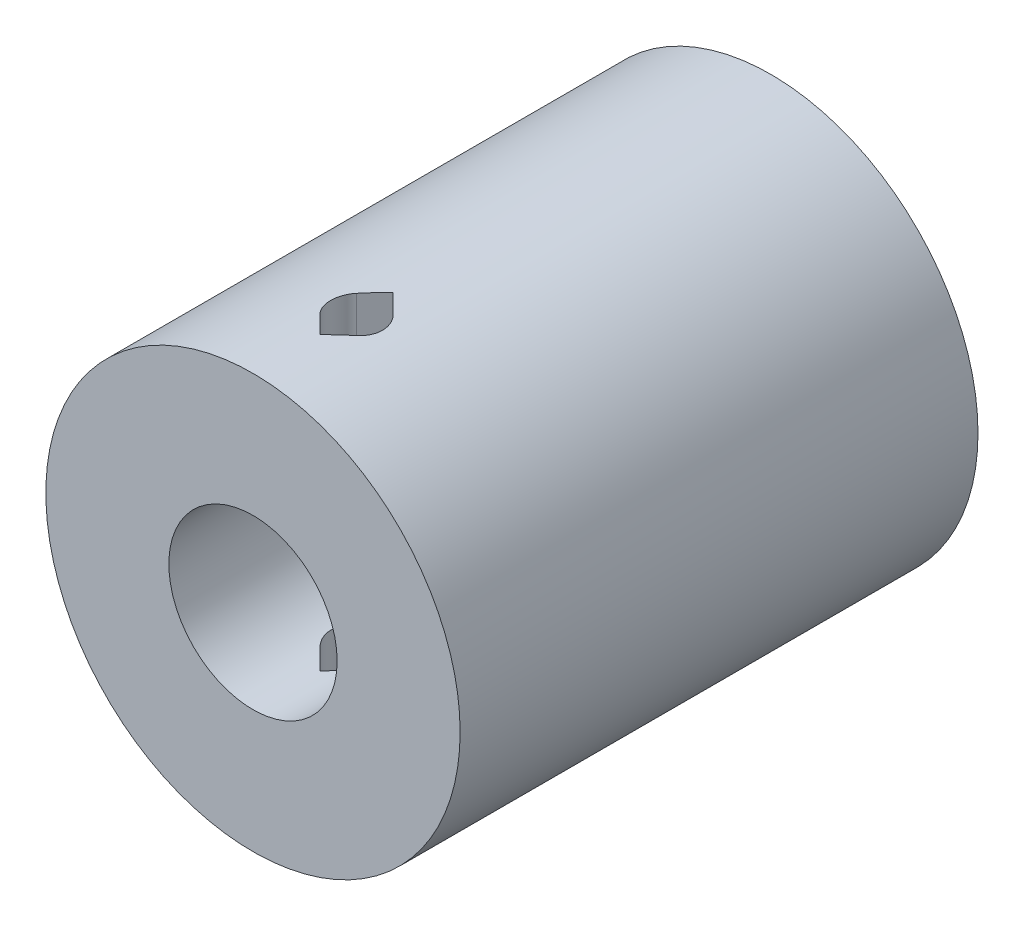
ISO-10303-21;
HEADER;
FILE_DESCRIPTION(('STEP AP214'),'2;1');
FILE_NAME('part.step','',(''),(''),'','','');
FILE_SCHEMA(('AUTOMOTIVE_DESIGN { 1 0 10303 214 1 1 1 1 }'));
ENDSEC;
DATA;
#1=APPLICATION_CONTEXT('core data for automotive mechanical design processes');
#2=APPLICATION_PROTOCOL_DEFINITION('international standard','automotive_design',2000,#1);
#3=PRODUCT_CONTEXT('',#1,'mechanical');
#4=PRODUCT('Part','Part','',(#3));
#5=PRODUCT_RELATED_PRODUCT_CATEGORY('part','',(#4));
#6=PRODUCT_DEFINITION_FORMATION('','',#4);
#7=PRODUCT_DEFINITION_CONTEXT('part definition',#1,'design');
#8=PRODUCT_DEFINITION('design','',#6,#7);
#9=PRODUCT_DEFINITION_SHAPE('','',#8);
#10=(LENGTH_UNIT() NAMED_UNIT(*) SI_UNIT(.MILLI.,.METRE.));
#11=(NAMED_UNIT(*) PLANE_ANGLE_UNIT() SI_UNIT($,.RADIAN.));
#12=(NAMED_UNIT(*) SI_UNIT($,.STERADIAN.) SOLID_ANGLE_UNIT());
#13=UNCERTAINTY_MEASURE_WITH_UNIT(LENGTH_MEASURE(1.E-05),#10,'distance_accuracy_value','');
#14=(GEOMETRIC_REPRESENTATION_CONTEXT(3) GLOBAL_UNCERTAINTY_ASSIGNED_CONTEXT((#13)) GLOBAL_UNIT_ASSIGNED_CONTEXT((#10,
#11,#12)) REPRESENTATION_CONTEXT('',''));
#15=CARTESIAN_POINT('',(0.,0.,0.));
#16=DIRECTION('',(0.,0.,1.));
#17=DIRECTION('',(1.,0.,0.));
#18=AXIS2_PLACEMENT_3D('',#15,#16,#17);
#19=CARTESIAN_POINT('',(0.,0.,12.));
#20=DIRECTION('',(0.,0.,-1.));
#21=DIRECTION('',(-1.,0.,0.));
#22=AXIS2_PLACEMENT_3D('',#19,#20,#21);
#23=CYLINDRICAL_SURFACE('',#22,8.);
#24=CARTESIAN_POINT('',(0.707106781186554,7.96868872525461,7.29289321881346));
#25=CARTESIAN_POINT('',(0.746862145229429,7.96515709103125,7.33258404753605));
#26=CARTESIAN_POINT('',(0.78320103730727,7.9616357489408,7.37567837300214));
#27=CARTESIAN_POINT('',(0.84816897546063,7.95497921352591,7.4673290143472));
#28=CARTESIAN_POINT('',(0.876801693794671,7.95184383666357,7.51588271295064));
#29=CARTESIAN_POINT('',(0.925535379750706,7.94631898401423,7.61717952544982));
#30=CARTESIAN_POINT('',(0.945630942848141,7.94392998097845,7.66992526815468));
#31=CARTESIAN_POINT('',(0.976680323267441,7.94017274452224,7.77806078491189));
#32=CARTESIAN_POINT('',(0.987636897127691,7.93880420331926,7.83344975637014));
#33=CARTESIAN_POINT('',(1.00005576818294,7.93724939522374,7.94501482202784));
#34=CARTESIAN_POINT('',(1.00156575259578,7.93705719018941,8.00118552575233));
#35=CARTESIAN_POINT('',(0.995172490311846,7.93786127855559,8.11299148245489));
#36=CARTESIAN_POINT('',(0.987267506616719,7.9388577912666,8.16862663471809));
#37=CARTESIAN_POINT('',(0.962320739006834,7.94192007649058,8.27758597681951));
#38=CARTESIAN_POINT('',(0.945307923520545,7.94398245817764,8.33091691741764));
#39=CARTESIAN_POINT('',(0.902655612468504,7.94894146479201,8.43395612614799));
#40=CARTESIAN_POINT('',(0.877020238355116,7.95183769105917,8.48366611125788));
#41=CARTESIAN_POINT('',(0.827459316259774,7.95711714874891,8.56279049727067));
#42=CARTESIAN_POINT('',(0.805661832925506,7.95936338433339,8.59356953878151));
#43=CARTESIAN_POINT('',(0.758781513515916,7.96396908930962,8.65243086781842));
#44=CARTESIAN_POINT('',(0.733703565151139,7.96632838699519,8.68051706173002));
#45=CARTESIAN_POINT('',(0.707106781186552,7.96868872525461,8.70710678118654));
#46=B_SPLINE_CURVE_WITH_KNOTS('',3,(#24,#25,#26,#27,#28,#29,#30,#31,#32,#33,#34,#35,#36,#37,#38,
#39,#40,#41,#42,#43,#44,#45),.UNSPECIFIED.,.F.,.F.,(4,2,2,2,2,2,2,2,2,2,4),(0.,
0.168648066890811,0.337215624269314,0.505889736441538,0.674512954038989,0.842284255270953,
1.01008651397606,1.17735820330587,1.34455005265491,1.45767339368495,1.57063006717695),.UNSPECIFIED.);
#47=CARTESIAN_POINT('',(0.707106781186554,7.96868872525461,7.29289321881346));
#48=VERTEX_POINT('',#47);
#49=CARTESIAN_POINT('',(0.707106781186552,7.96868872525461,8.70710678118654));
#50=VERTEX_POINT('',#49);
#51=EDGE_CURVE('E231',#48,#50,#46,.T.);
#52=ORIENTED_EDGE('',*,*,#51,.T.);
#53=CARTESIAN_POINT('',(0.,0.,9.41421356237311));
#54=DIRECTION('',(0.707106781186554,0.,0.707106781186541));
#55=DIRECTION('',(0.707106781186541,0.,-0.707106781186554));
#56=AXIS2_PLACEMENT_3D('',#53,#54,#55);
#57=ELLIPSE('',#56,11.3137084989849,8.);
#58=CARTESIAN_POINT('',(0.,8.,9.41421356237311));
#59=VERTEX_POINT('',#58);
#60=EDGE_CURVE('E222',#50,#59,#57,.T.);
#61=ORIENTED_EDGE('',*,*,#60,.T.);
#62=CARTESIAN_POINT('',(0.,0.,9.41421356237311));
#63=DIRECTION('',(-0.707106781186551,0.,0.707106781186544));
#64=DIRECTION('',(-0.707106781186544,0.,-0.707106781186551));
#65=AXIS2_PLACEMENT_3D('',#62,#63,#64);
#66=ELLIPSE('',#65,11.3137084989848,8.);
#67=CARTESIAN_POINT('',(-0.707106781186552,7.96868872525461,8.70710678118654));
#68=VERTEX_POINT('',#67);
#69=EDGE_CURVE('E206',#59,#68,#66,.T.);
#70=ORIENTED_EDGE('',*,*,#69,.T.);
#71=CARTESIAN_POINT('',(-0.707106781186552,7.96868872525461,8.70710678118654));
#72=CARTESIAN_POINT('',(-0.746862145229427,7.96515709103125,8.66741595246395));
#73=CARTESIAN_POINT('',(-0.783201037307267,7.9616357489408,8.62432162699787));
#74=CARTESIAN_POINT('',(-0.848168975460628,7.95497921352591,8.5326709856528));
#75=CARTESIAN_POINT('',(-0.87680169379467,7.95184383666357,8.48411728704937));
#76=CARTESIAN_POINT('',(-0.925535379750705,7.94631898401423,8.38282047455019));
#77=CARTESIAN_POINT('',(-0.945630942848141,7.94392998097845,8.33007473184532));
#78=CARTESIAN_POINT('',(-0.976680323267441,7.94017274452224,8.22193921508811));
#79=CARTESIAN_POINT('',(-0.987636897127691,7.93880420331926,8.16655024362986));
#80=CARTESIAN_POINT('',(-1.00005576818294,7.93724939522374,8.05498517797216));
#81=CARTESIAN_POINT('',(-1.00156575259578,7.93705719018941,7.99881447424768));
#82=CARTESIAN_POINT('',(-0.995172490311846,7.93786127855559,7.88700851754511));
#83=CARTESIAN_POINT('',(-0.987267506616719,7.9388577912666,7.83137336528192));
#84=CARTESIAN_POINT('',(-0.962320739006834,7.94192007649058,7.72241402318049));
#85=CARTESIAN_POINT('',(-0.945307923520546,7.94398245817764,7.66908308258236));
#86=CARTESIAN_POINT('',(-0.902655612468505,7.94894146479201,7.56604387385201));
#87=CARTESIAN_POINT('',(-0.877020238355117,7.95183769105917,7.51633388874213));
#88=CARTESIAN_POINT('',(-0.827459316259776,7.95711714874891,7.43720950272933));
#89=CARTESIAN_POINT('',(-0.805661832925507,7.95936338433339,7.4064304612185));
#90=CARTESIAN_POINT('',(-0.758781513515917,7.96396908930962,7.34756913218158));
#91=CARTESIAN_POINT('',(-0.733703565151139,7.96632838699519,7.31948293826998));
#92=CARTESIAN_POINT('',(-0.707106781186552,7.96868872525461,7.29289321881346));
#93=B_SPLINE_CURVE_WITH_KNOTS('',3,(#71,#72,#73,#74,#75,#76,#77,#78,#79,#80,#81,#82,#83,#84,#85,
#86,#87,#88,#89,#90,#91,#92),.UNSPECIFIED.,.F.,.F.,(4,2,2,2,2,2,2,2,2,2,4),(0.,0.16864806689081,
0.337215624269314,0.505889736441541,0.67451295403899,0.842284255270954,1.01008651397606,
1.17735820330587,1.34455005265491,1.45767339368495,1.57063006717696),.UNSPECIFIED.);
#94=CARTESIAN_POINT('',(-0.707106781186552,7.96868872525461,7.29289321881346));
#95=VERTEX_POINT('',#94);
#96=EDGE_CURVE('E217',#68,#95,#93,.T.);
#97=ORIENTED_EDGE('',*,*,#96,.T.);
#98=CARTESIAN_POINT('',(0.,0.,6.5857864376269));
#99=DIRECTION('',(0.707106781186552,0.,0.707106781186543));
#100=DIRECTION('',(0.707106781186543,0.,-0.707106781186552));
#101=AXIS2_PLACEMENT_3D('',#98,#99,#100);
#102=ELLIPSE('',#101,11.3137084989848,8.);
#103=CARTESIAN_POINT('',(0.,8.,6.58578643762689));
#104=VERTEX_POINT('',#103);
#105=EDGE_CURVE('E504',#104,#95,#102,.T.);
#106=ORIENTED_EDGE('',*,*,#105,.F.);
#107=CARTESIAN_POINT('',(0.,0.,6.58578643762689));
#108=DIRECTION('',(-0.707106781186553,0.,0.707106781186542));
#109=DIRECTION('',(-0.707106781186542,0.,-0.707106781186553));
#110=AXIS2_PLACEMENT_3D('',#107,#108,#109);
#111=ELLIPSE('',#110,11.3137084989849,8.);
#112=EDGE_CURVE('E499',#48,#104,#111,.T.);
#113=ORIENTED_EDGE('',*,*,#112,.F.);
#114=EDGE_LOOP('',(#52,#61,#70,#97,#106,#113));
#115=FACE_BOUND('',#114,.T.);
#116=CARTESIAN_POINT('',(0.,0.,12.));
#117=DIRECTION('',(0.,0.,1.));
#118=DIRECTION('',(1.,0.,0.));
#119=AXIS2_PLACEMENT_3D('',#116,#117,#118);
#120=CIRCLE('',#119,8.);
#121=CARTESIAN_POINT('',(8.,0.,12.));
#122=VERTEX_POINT('',#121);
#123=EDGE_CURVE('E334',#122,#122,#120,.T.);
#124=ORIENTED_EDGE('',*,*,#123,.F.);
#125=EDGE_LOOP('',(#124));
#126=FACE_BOUND('',#125,.T.);
#127=CARTESIAN_POINT('',(0.,0.,-8.));
#128=DIRECTION('',(0.,0.,1.));
#129=DIRECTION('',(1.,0.,0.));
#130=AXIS2_PLACEMENT_3D('',#127,#128,#129);
#131=CIRCLE('',#130,8.);
#132=CARTESIAN_POINT('',(8.,0.,-8.));
#133=VERTEX_POINT('',#132);
#134=EDGE_CURVE('E598',#133,#133,#131,.T.);
#135=ORIENTED_EDGE('',*,*,#134,.T.);
#136=EDGE_LOOP('',(#135));
#137=FACE_BOUND('',#136,.T.);
#138=CARTESIAN_POINT('',(-0.707106781186552,-7.96868872525461,8.70710678118654));
#139=VERTEX_POINT('',#138);
#140=CARTESIAN_POINT('',(0.,-8.,9.41421356237311));
#141=VERTEX_POINT('',#140);
#142=EDGE_CURVE('E216',#139,#141,#66,.T.);
#143=ORIENTED_EDGE('',*,*,#142,.T.);
#144=CARTESIAN_POINT('',(0.707106781186552,-7.96868872525461,8.70710678118654));
#145=VERTEX_POINT('',#144);
#146=EDGE_CURVE('E233',#141,#145,#57,.T.);
#147=ORIENTED_EDGE('',*,*,#146,.T.);
#148=CARTESIAN_POINT('',(0.707106781186553,-7.96868872525461,8.70710678118654));
#149=CARTESIAN_POINT('',(0.746862145229428,-7.96515709103125,8.66741595246395));
#150=CARTESIAN_POINT('',(0.783201037307269,-7.9616357489408,8.62432162699786));
#151=CARTESIAN_POINT('',(0.84816897546063,-7.95497921352591,8.5326709856528));
#152=CARTESIAN_POINT('',(0.876801693794671,-7.95184383666357,8.48411728704936));
#153=CARTESIAN_POINT('',(0.925535379750705,-7.94631898401423,8.38282047455018));
#154=CARTESIAN_POINT('',(0.94563094284814,-7.94392998097845,8.33007473184532));
#155=CARTESIAN_POINT('',(0.97668032326744,-7.94017274452225,8.22193921508812));
#156=CARTESIAN_POINT('',(0.98763689712769,-7.93880420331926,8.16655024362986));
#157=CARTESIAN_POINT('',(1.00005576818294,-7.93724939522374,8.05498517797216));
#158=CARTESIAN_POINT('',(1.00156575259578,-7.93705719018941,7.99881447424767));
#159=CARTESIAN_POINT('',(0.995172490311846,-7.93786127855559,7.88700851754511));
#160=CARTESIAN_POINT('',(0.987267506616719,-7.9388577912666,7.83137336528191));
#161=CARTESIAN_POINT('',(0.962320739006834,-7.94192007649058,7.72241402318049));
#162=CARTESIAN_POINT('',(0.945307923520546,-7.94398245817764,7.66908308258236));
#163=CARTESIAN_POINT('',(0.902655612468505,-7.94894146479201,7.56604387385201));
#164=CARTESIAN_POINT('',(0.877020238355117,-7.95183769105917,7.51633388874213));
#165=CARTESIAN_POINT('',(0.827459316259775,-7.95711714874891,7.43720950272933));
#166=CARTESIAN_POINT('',(0.805661832925507,-7.95936338433339,7.4064304612185));
#167=CARTESIAN_POINT('',(0.758781513515917,-7.96396908930962,7.34756913218158));
#168=CARTESIAN_POINT('',(0.73370356515114,-7.96632838699519,7.31948293826999));
#169=CARTESIAN_POINT('',(0.707106781186554,-7.96868872525461,7.29289321881346));
#170=B_SPLINE_CURVE_WITH_KNOTS('',3,(#148,#149,#150,#151,#152,#153,#154,#155,#156,#157,#158,
#159,#160,#161,#162,#163,#164,#165,#166,#167,#168,#169),.UNSPECIFIED.,.F.,.F.,(4,2,2,2,2,2,2,2,
2,2,4),(0.,0.168648066890811,0.337215624269313,0.505889736441535,0.674512954038988,
0.842284255270955,1.01008651397606,1.17735820330587,1.3445500526549,1.45767339368495,
1.57063006717695),.UNSPECIFIED.);
#171=CARTESIAN_POINT('',(0.707106781186554,-7.96868872525461,7.29289321881346));
#172=VERTEX_POINT('',#171);
#173=EDGE_CURVE('E232',#145,#172,#170,.T.);
#174=ORIENTED_EDGE('',*,*,#173,.T.);
#175=CARTESIAN_POINT('',(0.,-8.,6.58578643762689));
#176=VERTEX_POINT('',#175);
#177=EDGE_CURVE('E500',#176,#172,#111,.T.);
#178=ORIENTED_EDGE('',*,*,#177,.F.);
#179=CARTESIAN_POINT('',(-0.707106781186552,-7.96868872525461,7.29289321881346));
#180=VERTEX_POINT('',#179);
#181=EDGE_CURVE('E501',#180,#176,#102,.T.);
#182=ORIENTED_EDGE('',*,*,#181,.F.);
#183=CARTESIAN_POINT('',(-0.707106781186552,-7.96868872525461,7.29289321881346));
#184=CARTESIAN_POINT('',(-0.746862145229427,-7.96515709103125,7.33258404753605));
#185=CARTESIAN_POINT('',(-0.783201037307268,-7.9616357489408,7.37567837300213));
#186=CARTESIAN_POINT('',(-0.848168975460628,-7.95497921352591,7.4673290143472));
#187=CARTESIAN_POINT('',(-0.87680169379467,-7.95184383666357,7.51588271295064));
#188=CARTESIAN_POINT('',(-0.925535379750704,-7.94631898401423,7.61717952544981));
#189=CARTESIAN_POINT('',(-0.94563094284814,-7.94392998097845,7.66992526815468));
#190=CARTESIAN_POINT('',(-0.97668032326744,-7.94017274452225,7.77806078491188));
#191=CARTESIAN_POINT('',(-0.98763689712769,-7.93880420331926,7.83344975637014));
#192=CARTESIAN_POINT('',(-1.00005576818294,-7.93724939522374,7.94501482202784));
#193=CARTESIAN_POINT('',(-1.00156575259578,-7.93705719018941,8.00118552575232));
#194=CARTESIAN_POINT('',(-0.995172490311846,-7.93786127855559,8.11299148245489));
#195=CARTESIAN_POINT('',(-0.98726750661672,-7.9388577912666,8.16862663471808));
#196=CARTESIAN_POINT('',(-0.962320739006835,-7.94192007649058,8.27758597681951));
#197=CARTESIAN_POINT('',(-0.945307923520547,-7.94398245817764,8.33091691741764));
#198=CARTESIAN_POINT('',(-0.902655612468506,-7.94894146479201,8.43395612614799));
#199=CARTESIAN_POINT('',(-0.877020238355117,-7.95183769105917,8.48366611125787));
#200=CARTESIAN_POINT('',(-0.827459316259775,-7.95711714874891,8.56279049727067));
#201=CARTESIAN_POINT('',(-0.805661832925507,-7.95936338433339,8.59356953878151));
#202=CARTESIAN_POINT('',(-0.758781513515917,-7.96396908930962,8.65243086781842));
#203=CARTESIAN_POINT('',(-0.733703565151139,-7.96632838699519,8.68051706173002));
#204=CARTESIAN_POINT('',(-0.707106781186552,-7.96868872525461,8.70710678118654));
#205=B_SPLINE_CURVE_WITH_KNOTS('',3,(#183,#184,#185,#186,#187,#188,#189,#190,#191,#192,#193,
#194,#195,#196,#197,#198,#199,#200,#201,#202,#203,#204),.UNSPECIFIED.,.F.,.F.,(4,2,2,2,2,2,2,2,
2,2,4),(0.,0.168648066890811,0.337215624269313,0.505889736441537,0.674512954038988,
0.842284255270954,1.01008651397606,1.17735820330587,1.34455005265491,1.45767339368495,
1.57063006717695),.UNSPECIFIED.);
#206=EDGE_CURVE('E289',#180,#139,#205,.T.);
#207=ORIENTED_EDGE('',*,*,#206,.T.);
#208=EDGE_LOOP('',(#143,#147,#174,#178,#182,#207));
#209=FACE_BOUND('',#208,.T.);
#210=ADVANCED_FACE('F71',(#115,#126,#137,#209),#23,.T.);
#211=CARTESIAN_POINT('',(0.,0.,12.));
#212=DIRECTION('',(0.,0.,-1.));
#213=DIRECTION('',(-1.,0.,0.));
#214=AXIS2_PLACEMENT_3D('',#211,#212,#213);
#215=CYLINDRICAL_SURFACE('',#214,3.25);
#216=CARTESIAN_POINT('',(0.,0.,12.));
#217=DIRECTION('',(0.,0.,1.));
#218=DIRECTION('',(1.,0.,0.));
#219=AXIS2_PLACEMENT_3D('',#216,#217,#218);
#220=CIRCLE('',#219,3.25);
#221=CARTESIAN_POINT('',(3.25,0.,12.));
#222=VERTEX_POINT('',#221);
#223=EDGE_CURVE('E338',#222,#222,#220,.T.);
#224=ORIENTED_EDGE('',*,*,#223,.T.);
#225=EDGE_LOOP('',(#224));
#226=FACE_BOUND('',#225,.T.);
#227=CARTESIAN_POINT('',(2.29809703885628,2.29809703885628,4.));
#228=CARTESIAN_POINT('',(2.02726370552294,2.56893037218962,4.));
#229=CARTESIAN_POINT('',(1.68570818789725,2.81176543768399,4.));
#230=CARTESIAN_POINT('',(0.895944570846703,3.15355676931118,4.));
#231=CARTESIAN_POINT('',(0.448731359237518,3.25,4.));
#232=CARTESIAN_POINT('',(-0.448731359237519,3.25,4.));
#233=CARTESIAN_POINT('',(-0.895944570846704,3.15355676931118,4.));
#234=CARTESIAN_POINT('',(-1.68570818789725,2.81176543768399,4.));
#235=CARTESIAN_POINT('',(-2.02726370552294,2.56893037218962,4.));
#236=CARTESIAN_POINT('',(-2.29809703885628,2.29809703885628,4.));
#237=B_SPLINE_CURVE_WITH_KNOTS('',3,(#227,#228,#229,#230,#231,#232,#233,#234,#235,#236),
.UNSPECIFIED.,.F.,.F.,(4,2,2,2,4),(0.,0.25,0.5,0.75,1.),.UNSPECIFIED.);
#238=CARTESIAN_POINT('',(2.29809703885628,2.29809703885628,4.));
#239=VERTEX_POINT('',#238);
#240=CARTESIAN_POINT('',(-2.29809703885627,2.29809703885628,4.));
#241=VERTEX_POINT('',#240);
#242=EDGE_CURVE('E343',#239,#241,#237,.T.);
#243=ORIENTED_EDGE('',*,*,#242,.F.);
#244=CARTESIAN_POINT('',(0.,0.,4.));
#245=DIRECTION('',(0.,0.,1.));
#246=DIRECTION('',(1.,0.,0.));
#247=AXIS2_PLACEMENT_3D('',#244,#245,#246);
#248=CIRCLE('',#247,3.25);
#249=CARTESIAN_POINT('',(2.29809703885628,-2.29809703885628,4.));
#250=VERTEX_POINT('',#249);
#251=EDGE_CURVE('E512',#250,#239,#248,.T.);
#252=ORIENTED_EDGE('',*,*,#251,.F.);
#253=CARTESIAN_POINT('',(-2.29809703885628,-2.29809703885628,4.));
#254=VERTEX_POINT('',#253);
#255=EDGE_CURVE('E517',#254,#250,#248,.T.);
#256=ORIENTED_EDGE('',*,*,#255,.F.);
#257=EDGE_CURVE('E515',#241,#254,#248,.T.);
#258=ORIENTED_EDGE('',*,*,#257,.F.);
#259=EDGE_LOOP('',(#243,#252,#256,#258));
#260=FACE_BOUND('',#259,.T.);
#261=CARTESIAN_POINT('',(-0.707106781186552,-3.17214438511238,7.29289321881346));
#262=CARTESIAN_POINT('',(-0.746593334406575,-3.16333762555174,7.33233215420642));
#263=CARTESIAN_POINT('',(-0.782735776537035,-3.15450976718204,7.37512757412699));
#264=CARTESIAN_POINT('',(-0.847512361736123,-3.13773077466973,7.46629961061007));
#265=CARTESIAN_POINT('',(-0.876137038711045,-3.12978075309404,7.51468315426803));
#266=CARTESIAN_POINT('',(-0.924989243072333,-3.11569313789824,7.61586636856759));
#267=CARTESIAN_POINT('',(-0.945204835927775,-3.10955812375364,7.66867218875724));
#268=CARTESIAN_POINT('',(-0.976472871935581,-3.0998826545139,7.7771123331458));
#269=CARTESIAN_POINT('',(-0.987534656835855,-3.09633955471841,7.83274371206277));
#270=CARTESIAN_POINT('',(-0.99989998420494,-3.09236819235412,7.94341107433177));
#271=CARTESIAN_POINT('',(-1.00150011716458,-3.09184527000295,7.99841055397749));
#272=CARTESIAN_POINT('',(-0.995673068974839,-3.09372659289699,8.10788744427915));
#273=CARTESIAN_POINT('',(-0.988244541817269,-3.09613127459453,8.16236477587191));
#274=CARTESIAN_POINT('',(-0.964897962689587,-3.1034844039724,8.26802535742545));
#275=CARTESIAN_POINT('',(-0.949167740724516,-3.10837648674462,8.31925444765068));
#276=CARTESIAN_POINT('',(-0.909842418846047,-3.12011299516784,8.41836417097667));
#277=CARTESIAN_POINT('',(-0.886246860497279,-3.12695753461549,8.46624460870256));
#278=CARTESIAN_POINT('',(-0.837847376798987,-3.14022192930089,8.54747806807866));
#279=CARTESIAN_POINT('',(-0.814442560246159,-3.14640589295648,8.58171462947098));
#280=CARTESIAN_POINT('',(-0.763663971232291,-3.15911389365509,8.64693494290907));
#281=CARTESIAN_POINT('',(-0.736297463609134,-3.16563729451692,8.67792447373579));
#282=CARTESIAN_POINT('',(-0.707106781186552,-3.17214438511238,8.70710678118654));
#283=B_SPLINE_CURVE_WITH_KNOTS('',3,(#261,#262,#263,#264,#265,#266,#267,#268,#269,#270,#271,
#272,#273,#274,#275,#276,#277,#278,#279,#280,#281,#282),.UNSPECIFIED.,.F.,.F.,(4,2,2,2,2,2,2,2,
2,2,4),(0.,0.16932538392887,0.338862964896849,0.508640346580278,0.678244250700254,
0.842502226889372,1.00678469394439,1.16750019383097,1.32822506274547,1.45371208118759,
1.57897183343096),.UNSPECIFIED.);
#284=CARTESIAN_POINT('',(-0.707106781186552,-3.17214438511238,7.29289321881346));
#285=VERTEX_POINT('',#284);
#286=CARTESIAN_POINT('',(-0.707106781186552,-3.17214438511238,8.70710678118654));
#287=VERTEX_POINT('',#286);
#288=EDGE_CURVE('E263',#285,#287,#283,.T.);
#289=ORIENTED_EDGE('',*,*,#288,.F.);
#290=CARTESIAN_POINT('',(0.,0.,6.5857864376269));
#291=DIRECTION('',(0.707106781186552,0.,0.707106781186543));
#292=DIRECTION('',(0.707106781186543,0.,-0.707106781186552));
#293=AXIS2_PLACEMENT_3D('',#290,#291,#292);
#294=ELLIPSE('',#293,4.59619407771259,3.25);
#295=CARTESIAN_POINT('',(0.,-3.25,6.58578643762689));
#296=VERTEX_POINT('',#295);
#297=EDGE_CURVE('E88',#285,#296,#294,.T.);
#298=ORIENTED_EDGE('',*,*,#297,.T.);
#299=CARTESIAN_POINT('',(0.,0.,6.58578643762689));
#300=DIRECTION('',(-0.707106781186553,0.,0.707106781186542));
#301=DIRECTION('',(-0.707106781186542,0.,-0.707106781186553));
#302=AXIS2_PLACEMENT_3D('',#299,#300,#301);
#303=ELLIPSE('',#302,4.5961940777126,3.25);
#304=CARTESIAN_POINT('',(0.707106781186554,-3.17214438511238,7.29289321881346));
#305=VERTEX_POINT('',#304);
#306=EDGE_CURVE('E328',#296,#305,#303,.T.);
#307=ORIENTED_EDGE('',*,*,#306,.T.);
#308=CARTESIAN_POINT('',(0.707106781186553,-3.17214438511238,8.70710678118654));
#309=CARTESIAN_POINT('',(0.746593334406576,-3.16333762555174,8.66766784579358));
#310=CARTESIAN_POINT('',(0.782735776537036,-3.15450976718204,8.62487242587301));
#311=CARTESIAN_POINT('',(0.847512361736124,-3.13773077466973,8.53370038938993));
#312=CARTESIAN_POINT('',(0.876137038711046,-3.12978075309404,8.48531684573197));
#313=CARTESIAN_POINT('',(0.924989243072334,-3.11569313789824,8.38413363143241));
#314=CARTESIAN_POINT('',(0.945204835927777,-3.10955812375364,8.33132781124276));
#315=CARTESIAN_POINT('',(0.976472871935582,-3.0998826545139,8.22288766685419));
#316=CARTESIAN_POINT('',(0.987534656835855,-3.09633955471841,8.16725628793722));
#317=CARTESIAN_POINT('',(0.99989998420494,-3.09236819235412,8.05658892566823));
#318=CARTESIAN_POINT('',(1.00150011716458,-3.09184527000295,8.0015894460225));
#319=CARTESIAN_POINT('',(0.995673068974839,-3.09372659289699,7.89211255572084));
#320=CARTESIAN_POINT('',(0.988244541817269,-3.09613127459453,7.83763522412808));
#321=CARTESIAN_POINT('',(0.964897962689587,-3.1034844039724,7.73197464257455));
#322=CARTESIAN_POINT('',(0.949167740724516,-3.10837648674462,7.68074555234931));
#323=CARTESIAN_POINT('',(0.909842418846046,-3.12011299516784,7.58163582902333));
#324=CARTESIAN_POINT('',(0.886246860497278,-3.12695753461549,7.53375539129743));
#325=CARTESIAN_POINT('',(0.837847376798986,-3.14022192930089,7.45252193192134));
#326=CARTESIAN_POINT('',(0.814442560246159,-3.14640589295648,7.41828537052902));
#327=CARTESIAN_POINT('',(0.763663971232292,-3.15911389365509,7.35306505709093));
#328=CARTESIAN_POINT('',(0.736297463609135,-3.16563729451692,7.32207552626421));
#329=CARTESIAN_POINT('',(0.707106781186553,-3.17214438511238,7.29289321881346));
#330=B_SPLINE_CURVE_WITH_KNOTS('',3,(#308,#309,#310,#311,#312,#313,#314,#315,#316,#317,#318,
#319,#320,#321,#322,#323,#324,#325,#326,#327,#328,#329),.UNSPECIFIED.,.F.,.F.,(4,2,2,2,2,2,2,2,
2,2,4),(0.,0.16932538392887,0.33886296489685,0.508640346580281,0.678244250700256,
0.842502226889373,1.00678469394438,1.16750019383097,1.32822506274547,1.45371208118759,
1.57897183343096),.UNSPECIFIED.);
#331=CARTESIAN_POINT('',(0.707106781186552,-3.17214438511238,8.70710678118654));
#332=VERTEX_POINT('',#331);
#333=EDGE_CURVE('E273',#332,#305,#330,.T.);
#334=ORIENTED_EDGE('',*,*,#333,.F.);
#335=CARTESIAN_POINT('',(0.,0.,9.41421356237311));
#336=DIRECTION('',(0.707106781186554,0.,0.707106781186541));
#337=DIRECTION('',(0.707106781186541,0.,-0.707106781186554));
#338=AXIS2_PLACEMENT_3D('',#335,#336,#337);
#339=ELLIPSE('',#338,4.5961940777126,3.25);
#340=CARTESIAN_POINT('',(0.,-3.25,9.41421356237311));
#341=VERTEX_POINT('',#340);
#342=EDGE_CURVE('E335',#341,#332,#339,.T.);
#343=ORIENTED_EDGE('',*,*,#342,.F.);
#344=CARTESIAN_POINT('',(0.,0.,9.41421356237311));
#345=DIRECTION('',(-0.707106781186551,0.,0.707106781186544));
#346=DIRECTION('',(-0.707106781186544,0.,-0.707106781186551));
#347=AXIS2_PLACEMENT_3D('',#344,#345,#346);
#348=ELLIPSE('',#347,4.59619407771258,3.25);
#349=EDGE_CURVE('E333',#287,#341,#348,.T.);
#350=ORIENTED_EDGE('',*,*,#349,.F.);
#351=EDGE_LOOP('',(#289,#298,#307,#334,#343,#350));
#352=FACE_BOUND('',#351,.T.);
#353=CARTESIAN_POINT('',(0.707106781186554,3.17214438511238,7.29289321881346));
#354=VERTEX_POINT('',#353);
#355=CARTESIAN_POINT('',(0.,3.25,6.58578643762689));
#356=VERTEX_POINT('',#355);
#357=EDGE_CURVE('E86',#354,#356,#303,.T.);
#358=ORIENTED_EDGE('',*,*,#357,.T.);
#359=CARTESIAN_POINT('',(-0.707106781186552,3.17214438511238,7.29289321881346));
#360=VERTEX_POINT('',#359);
#361=EDGE_CURVE('E12',#356,#360,#294,.T.);
#362=ORIENTED_EDGE('',*,*,#361,.T.);
#363=CARTESIAN_POINT('',(-0.707106781186552,3.17214438511238,8.70710678118654));
#364=CARTESIAN_POINT('',(-0.746593334406575,3.16333762555174,8.66766784579358));
#365=CARTESIAN_POINT('',(-0.782735776537035,3.15450976718204,8.62487242587301));
#366=CARTESIAN_POINT('',(-0.847512361736123,3.13773077466973,8.53370038938993));
#367=CARTESIAN_POINT('',(-0.876137038711045,3.12978075309404,8.48531684573197));
#368=CARTESIAN_POINT('',(-0.924989243072333,3.11569313789824,8.38413363143241));
#369=CARTESIAN_POINT('',(-0.945204835927775,3.10955812375364,8.33132781124276));
#370=CARTESIAN_POINT('',(-0.976472871935581,3.0998826545139,8.2228876668542));
#371=CARTESIAN_POINT('',(-0.987534656835855,3.09633955471841,8.16725628793723));
#372=CARTESIAN_POINT('',(-0.99989998420494,3.09236819235412,8.05658892566823));
#373=CARTESIAN_POINT('',(-1.00150011716458,3.09184527000295,8.00158944602251));
#374=CARTESIAN_POINT('',(-0.995673068974839,3.09372659289699,7.89211255572085));
#375=CARTESIAN_POINT('',(-0.988244541817269,3.09613127459453,7.83763522412809));
#376=CARTESIAN_POINT('',(-0.964897962689587,3.1034844039724,7.73197464257455));
#377=CARTESIAN_POINT('',(-0.949167740724516,3.10837648674462,7.68074555234932));
#378=CARTESIAN_POINT('',(-0.909842418846047,3.12011299516784,7.58163582902333));
#379=CARTESIAN_POINT('',(-0.886246860497279,3.12695753461549,7.53375539129744));
#380=CARTESIAN_POINT('',(-0.837847376798987,3.14022192930089,7.45252193192134));
#381=CARTESIAN_POINT('',(-0.81444256024616,3.14640589295648,7.41828537052902));
#382=CARTESIAN_POINT('',(-0.763663971232292,3.15911389365509,7.35306505709093));
#383=CARTESIAN_POINT('',(-0.736297463609135,3.16563729451692,7.32207552626421));
#384=CARTESIAN_POINT('',(-0.707106781186552,3.17214438511238,7.29289321881346));
#385=B_SPLINE_CURVE_WITH_KNOTS('',3,(#363,#364,#365,#366,#367,#368,#369,#370,#371,#372,#373,
#374,#375,#376,#377,#378,#379,#380,#381,#382,#383,#384),.UNSPECIFIED.,.F.,.F.,(4,2,2,2,2,2,2,2,
2,2,4),(0.,0.169325383928871,0.33886296489685,0.508640346580279,0.678244250700256,
0.842502226889372,1.00678469394439,1.16750019383097,1.32822506274547,1.45371208118759,
1.57897183343096),.UNSPECIFIED.);
#386=CARTESIAN_POINT('',(-0.707106781186552,3.17214438511238,8.70710678118654));
#387=VERTEX_POINT('',#386);
#388=EDGE_CURVE('E281',#387,#360,#385,.T.);
#389=ORIENTED_EDGE('',*,*,#388,.F.);
#390=CARTESIAN_POINT('',(0.,3.25,9.41421356237311));
#391=VERTEX_POINT('',#390);
#392=EDGE_CURVE('E336',#391,#387,#348,.T.);
#393=ORIENTED_EDGE('',*,*,#392,.F.);
#394=CARTESIAN_POINT('',(0.707106781186552,3.17214438511238,8.70710678118654));
#395=VERTEX_POINT('',#394);
#396=EDGE_CURVE('E225',#395,#391,#339,.T.);
#397=ORIENTED_EDGE('',*,*,#396,.F.);
#398=CARTESIAN_POINT('',(0.707106781186554,3.17214438511238,7.29289321881346));
#399=CARTESIAN_POINT('',(0.746593334406576,3.16333762555174,7.33233215420642));
#400=CARTESIAN_POINT('',(0.782735776537036,3.15450976718204,7.37512757412699));
#401=CARTESIAN_POINT('',(0.847512361736124,3.13773077466973,7.46629961061007));
#402=CARTESIAN_POINT('',(0.876137038711046,3.12978075309404,7.51468315426803));
#403=CARTESIAN_POINT('',(0.924989243072334,3.11569313789824,7.61586636856759));
#404=CARTESIAN_POINT('',(0.945204835927776,3.10955812375364,7.66867218875724));
#405=CARTESIAN_POINT('',(0.976472871935581,3.0998826545139,7.77711233314581));
#406=CARTESIAN_POINT('',(0.987534656835855,3.09633955471841,7.83274371206278));
#407=CARTESIAN_POINT('',(0.99989998420494,3.09236819235412,7.94341107433177));
#408=CARTESIAN_POINT('',(1.00150011716458,3.09184527000295,7.9984105539775));
#409=CARTESIAN_POINT('',(0.995673068974838,3.09372659289699,8.10788744427916));
#410=CARTESIAN_POINT('',(0.988244541817269,3.09613127459453,8.16236477587192));
#411=CARTESIAN_POINT('',(0.964897962689587,3.1034844039724,8.26802535742545));
#412=CARTESIAN_POINT('',(0.949167740724515,3.10837648674462,8.31925444765069));
#413=CARTESIAN_POINT('',(0.909842418846046,3.12011299516784,8.41836417097667));
#414=CARTESIAN_POINT('',(0.886246860497278,3.12695753461549,8.46624460870257));
#415=CARTESIAN_POINT('',(0.837847376798986,3.14022192930089,8.54747806807866));
#416=CARTESIAN_POINT('',(0.81444256024616,3.14640589295648,8.58171462947098));
#417=CARTESIAN_POINT('',(0.763663971232292,3.15911389365509,8.64693494290907));
#418=CARTESIAN_POINT('',(0.736297463609135,3.16563729451692,8.67792447373579));
#419=CARTESIAN_POINT('',(0.707106781186553,3.17214438511238,8.70710678118654));
#420=B_SPLINE_CURVE_WITH_KNOTS('',3,(#398,#399,#400,#401,#402,#403,#404,#405,#406,#407,#408,
#409,#410,#411,#412,#413,#414,#415,#416,#417,#418,#419),.UNSPECIFIED.,.F.,.F.,(4,2,2,2,2,2,2,2,
2,2,4),(0.,0.169325383928871,0.33886296489685,0.508640346580277,0.678244250700255,
0.842502226889373,1.00678469394438,1.16750019383096,1.32822506274547,1.45371208118758,
1.57897183343096),.UNSPECIFIED.);
#421=EDGE_CURVE('E75',#354,#395,#420,.T.);
#422=ORIENTED_EDGE('',*,*,#421,.F.);
#423=EDGE_LOOP('',(#358,#362,#389,#393,#397,#422));
#424=FACE_BOUND('',#423,.T.);
#425=ADVANCED_FACE('F330',(#226,#260,#352,#424),#215,.F.);
#426=CARTESIAN_POINT('',(0.,0.,12.));
#427=DIRECTION('',(0.,0.,1.));
#428=DIRECTION('',(1.,0.,0.));
#429=AXIS2_PLACEMENT_3D('',#426,#427,#428);
#430=PLANE('',#429);
#431=ORIENTED_EDGE('',*,*,#123,.T.);
#432=EDGE_LOOP('',(#431));
#433=FACE_BOUND('',#432,.T.);
#434=ORIENTED_EDGE('',*,*,#223,.F.);
#435=EDGE_LOOP('',(#434));
#436=FACE_BOUND('',#435,.T.);
#437=ADVANCED_FACE('F366',(#433,#436),#430,.T.);
#438=CARTESIAN_POINT('',(0.,0.,-8.));
#439=DIRECTION('',(0.,0.,1.));
#440=DIRECTION('',(1.,0.,0.));
#441=AXIS2_PLACEMENT_3D('',#438,#439,#440);
#442=CYLINDRICAL_SURFACE('',#441,4.5);
#443=CARTESIAN_POINT('',(0.,0.,0.));
#444=DIRECTION('',(0.,0.,1.));
#445=DIRECTION('',(0.707106781186546,-0.707106781186549,0.));
#446=AXIS2_PLACEMENT_3D('',#443,#444,#445);
#447=CIRCLE('',#446,4.5);
#448=CARTESIAN_POINT('',(3.18198051533946,-3.18198051533947,0.));
#449=VERTEX_POINT('',#448);
#450=CARTESIAN_POINT('',(3.18198051533946,3.18198051533947,0.));
#451=VERTEX_POINT('',#450);
#452=EDGE_CURVE('E691',#449,#451,#447,.T.);
#453=ORIENTED_EDGE('',*,*,#452,.T.);
#454=DIRECTION('',(0.,0.,1.));
#455=VECTOR('',#454,1.);
#456=CARTESIAN_POINT('',(3.18198051533946,3.18198051533947,-8.));
#457=LINE('',#456,#455);
#458=CARTESIAN_POINT('',(3.18198051533946,3.18198051533947,-8.));
#459=VERTEX_POINT('',#458);
#460=EDGE_CURVE('E534',#459,#451,#457,.T.);
#461=ORIENTED_EDGE('',*,*,#460,.F.);
#462=CARTESIAN_POINT('',(0.,0.,-8.));
#463=DIRECTION('',(0.,0.,1.));
#464=DIRECTION('',(1.,0.,0.));
#465=AXIS2_PLACEMENT_3D('',#462,#463,#464);
#466=CIRCLE('',#465,4.5);
#467=CARTESIAN_POINT('',(3.18198051533946,-3.18198051533947,-8.));
#468=VERTEX_POINT('',#467);
#469=EDGE_CURVE('E612',#468,#459,#466,.T.);
#470=ORIENTED_EDGE('',*,*,#469,.F.);
#471=DIRECTION('',(0.,0.,1.));
#472=VECTOR('',#471,1.);
#473=CARTESIAN_POINT('',(3.18198051533946,-3.18198051533947,-8.));
#474=LINE('',#473,#472);
#475=EDGE_CURVE('E582',#468,#449,#474,.T.);
#476=ORIENTED_EDGE('',*,*,#475,.T.);
#477=EDGE_LOOP('',(#453,#461,#470,#476));
#478=FACE_BOUND('',#477,.T.);
#479=ADVANCED_FACE('F376',(#478),#442,.F.);
#480=CARTESIAN_POINT('',(0.,3.18198051533947,-8.));
#481=DIRECTION('',(0.,-1.,0.));
#482=DIRECTION('',(0.,0.,-1.));
#483=AXIS2_PLACEMENT_3D('',#480,#481,#482);
#484=PLANE('',#483);
#485=CARTESIAN_POINT('',(-3.18198051533946,3.18198051533947,0.));
#486=CARTESIAN_POINT('',(-2.65165042944955,3.18198051533947,0.));
#487=CARTESIAN_POINT('',(-2.12132034355964,3.18198051533947,0.));
#488=CARTESIAN_POINT('',(-1.06066017177982,3.18198051533947,0.));
#489=CARTESIAN_POINT('',(-0.530330085889906,3.18198051533947,0.));
#490=CARTESIAN_POINT('',(0.530330085889913,3.18198051533947,0.));
#491=CARTESIAN_POINT('',(1.06066017177982,3.18198051533947,0.));
#492=CARTESIAN_POINT('',(2.12132034355964,3.18198051533947,0.));
#493=CARTESIAN_POINT('',(2.65165042944955,3.18198051533947,0.));
#494=CARTESIAN_POINT('',(3.18198051533946,3.18198051533947,0.));
#495=B_SPLINE_CURVE_WITH_KNOTS('',3,(#485,#486,#487,#488,#489,#490,#491,#492,#493,#494),
.UNSPECIFIED.,.F.,.F.,(4,2,2,2,4),(0.,0.25,0.5,0.75,1.),.UNSPECIFIED.);
#496=CARTESIAN_POINT('',(-3.18198051533946,3.18198051533947,0.));
#497=VERTEX_POINT('',#496);
#498=EDGE_CURVE('E541',#497,#451,#495,.T.);
#499=ORIENTED_EDGE('',*,*,#498,.F.);
#500=DIRECTION('',(0.,0.,1.));
#501=VECTOR('',#500,1.);
#502=CARTESIAN_POINT('',(-3.18198051533946,3.18198051533947,-8.));
#503=LINE('',#502,#501);
#504=CARTESIAN_POINT('',(-3.18198051533946,3.18198051533947,-8.));
#505=VERTEX_POINT('',#504);
#506=EDGE_CURVE('E531',#505,#497,#503,.T.);
#507=ORIENTED_EDGE('',*,*,#506,.F.);
#508=DIRECTION('',(1.,0.,0.));
#509=VECTOR('',#508,1.);
#510=CARTESIAN_POINT('',(0.,3.18198051533947,-8.));
#511=LINE('',#510,#509);
#512=EDGE_CURVE('E602',#505,#459,#511,.T.);
#513=ORIENTED_EDGE('',*,*,#512,.T.);
#514=ORIENTED_EDGE('',*,*,#460,.T.);
#515=EDGE_LOOP('',(#499,#507,#513,#514));
#516=FACE_BOUND('',#515,.T.);
#517=ADVANCED_FACE('F380',(#516),#484,.T.);
#518=CARTESIAN_POINT('',(0.,0.,0.));
#519=DIRECTION('',(0.,0.,1.));
#520=DIRECTION('',(-0.707106781186546,0.707106781186549,0.));
#521=AXIS2_PLACEMENT_3D('',#518,#519,#520);
#522=CIRCLE('',#521,4.5);
#523=CARTESIAN_POINT('',(-3.18198051533946,-3.18198051533947,0.));
#524=VERTEX_POINT('',#523);
#525=EDGE_CURVE('E577',#497,#524,#522,.T.);
#526=ORIENTED_EDGE('',*,*,#525,.T.);
#527=DIRECTION('',(0.,0.,1.));
#528=VECTOR('',#527,1.);
#529=CARTESIAN_POINT('',(-3.18198051533946,-3.18198051533947,-8.));
#530=LINE('',#529,#528);
#531=CARTESIAN_POINT('',(-3.18198051533946,-3.18198051533947,-8.));
#532=VERTEX_POINT('',#531);
#533=EDGE_CURVE('E535',#532,#524,#530,.T.);
#534=ORIENTED_EDGE('',*,*,#533,.F.);
#535=EDGE_CURVE('E606',#505,#532,#466,.T.);
#536=ORIENTED_EDGE('',*,*,#535,.F.);
#537=ORIENTED_EDGE('',*,*,#506,.T.);
#538=EDGE_LOOP('',(#526,#534,#536,#537));
#539=FACE_BOUND('',#538,.T.);
#540=ADVANCED_FACE('F382',(#539),#442,.F.);
#541=CARTESIAN_POINT('',(0.,-3.18198051533947,-8.));
#542=DIRECTION('',(0.,1.,0.));
#543=DIRECTION('',(0.,0.,1.));
#544=AXIS2_PLACEMENT_3D('',#541,#542,#543);
#545=PLANE('',#544);
#546=CARTESIAN_POINT('',(3.18198051533946,-3.18198051533947,0.));
#547=CARTESIAN_POINT('',(2.65165042944955,-3.18198051533947,0.));
#548=CARTESIAN_POINT('',(2.12132034355964,-3.18198051533947,0.));
#549=CARTESIAN_POINT('',(1.06066017177982,-3.18198051533947,0.));
#550=CARTESIAN_POINT('',(0.530330085889908,-3.18198051533947,0.));
#551=CARTESIAN_POINT('',(-0.530330085889911,-3.18198051533947,0.));
#552=CARTESIAN_POINT('',(-1.06066017177982,-3.18198051533947,0.));
#553=CARTESIAN_POINT('',(-2.12132034355964,-3.18198051533947,0.));
#554=CARTESIAN_POINT('',(-2.65165042944955,-3.18198051533947,0.));
#555=CARTESIAN_POINT('',(-3.18198051533946,-3.18198051533947,0.));
#556=B_SPLINE_CURVE_WITH_KNOTS('',3,(#546,#547,#548,#549,#550,#551,#552,#553,#554,#555),
.UNSPECIFIED.,.F.,.F.,(4,2,2,2,4),(0.,0.25,0.5,0.75,1.),.UNSPECIFIED.);
#557=EDGE_CURVE('E595',#449,#524,#556,.T.);
#558=ORIENTED_EDGE('',*,*,#557,.F.);
#559=ORIENTED_EDGE('',*,*,#475,.F.);
#560=DIRECTION('',(-1.,0.,0.));
#561=VECTOR('',#560,1.);
#562=CARTESIAN_POINT('',(0.,-3.18198051533947,-8.));
#563=LINE('',#562,#561);
#564=EDGE_CURVE('E609',#468,#532,#563,.T.);
#565=ORIENTED_EDGE('',*,*,#564,.T.);
#566=ORIENTED_EDGE('',*,*,#533,.T.);
#567=EDGE_LOOP('',(#558,#559,#565,#566));
#568=FACE_BOUND('',#567,.T.);
#569=ADVANCED_FACE('F368',(#568),#545,.T.);
#570=CARTESIAN_POINT('',(0.,0.,-8.));
#571=DIRECTION('',(0.,0.,1.));
#572=DIRECTION('',(1.,0.,0.));
#573=AXIS2_PLACEMENT_3D('',#570,#571,#572);
#574=PLANE('',#573);
#575=ORIENTED_EDGE('',*,*,#469,.T.);
#576=ORIENTED_EDGE('',*,*,#512,.F.);
#577=ORIENTED_EDGE('',*,*,#535,.T.);
#578=ORIENTED_EDGE('',*,*,#564,.F.);
#579=EDGE_LOOP('',(#575,#576,#577,#578));
#580=FACE_BOUND('',#579,.T.);
#581=ORIENTED_EDGE('',*,*,#134,.F.);
#582=EDGE_LOOP('',(#581));
#583=FACE_BOUND('',#582,.T.);
#584=ADVANCED_FACE('F555',(#580,#583),#574,.F.);
#585=CARTESIAN_POINT('',(0.,0.,4.));
#586=DIRECTION('',(0.,0.,-1.));
#587=DIRECTION('',(-1.,0.,0.));
#588=AXIS2_PLACEMENT_3D('',#585,#586,#587);
#589=CONICAL_SURFACE('',#588,3.25,0.302884868374971);
#590=DIRECTION('',(-0.210912270304798,0.210912270304799,-0.95447997803503));
#591=VECTOR('',#590,1.);
#592=CARTESIAN_POINT('',(-2.29809703885627,2.29809703885628,4.));
#593=LINE('',#592,#591);
#594=EDGE_CURVE('E516',#241,#497,#593,.T.);
#595=ORIENTED_EDGE('',*,*,#594,.F.);
#596=ORIENTED_EDGE('',*,*,#257,.T.);
#597=DIRECTION('',(-0.210912270304798,-0.210912270304799,-0.95447997803503));
#598=VECTOR('',#597,1.);
#599=CARTESIAN_POINT('',(-2.29809703885628,-2.29809703885628,4.));
#600=LINE('',#599,#598);
#601=EDGE_CURVE('E674',#254,#524,#600,.T.);
#602=ORIENTED_EDGE('',*,*,#601,.T.);
#603=ORIENTED_EDGE('',*,*,#525,.F.);
#604=EDGE_LOOP('',(#595,#596,#602,#603));
#605=FACE_BOUND('',#604,.T.);
#606=ADVANCED_FACE('F631',(#605),#589,.F.);
#607=CARTESIAN_POINT('',(2.29809703885628,-2.29809703885628,4.));
#608=CARTESIAN_POINT('',(3.18198051533946,-3.18198051533947,0.));
#609=CARTESIAN_POINT('',(2.02726370552294,-2.56893037218962,4.));
#610=CARTESIAN_POINT('',(2.65165042944955,-3.18198051533947,0.));
#611=CARTESIAN_POINT('',(1.68570818789725,-2.81176543768399,4.));
#612=CARTESIAN_POINT('',(2.12132034355964,-3.18198051533947,0.));
#613=CARTESIAN_POINT('',(0.895944570846703,-3.15355676931118,4.));
#614=CARTESIAN_POINT('',(1.06066017177982,-3.18198051533947,0.));
#615=CARTESIAN_POINT('',(0.448731359237518,-3.25,4.));
#616=CARTESIAN_POINT('',(0.530330085889908,-3.18198051533947,0.));
#617=CARTESIAN_POINT('',(-0.448731359237519,-3.25,4.));
#618=CARTESIAN_POINT('',(-0.530330085889911,-3.18198051533947,0.));
#619=CARTESIAN_POINT('',(-0.895944570846704,-3.15355676931118,4.));
#620=CARTESIAN_POINT('',(-1.06066017177982,-3.18198051533947,0.));
#621=CARTESIAN_POINT('',(-1.68570818789725,-2.81176543768399,4.));
#622=CARTESIAN_POINT('',(-2.12132034355964,-3.18198051533947,0.));
#623=CARTESIAN_POINT('',(-2.02726370552294,-2.56893037218962,4.));
#624=CARTESIAN_POINT('',(-2.65165042944955,-3.18198051533947,0.));
#625=CARTESIAN_POINT('',(-2.29809703885628,-2.29809703885628,4.));
#626=CARTESIAN_POINT('',(-3.18198051533946,-3.18198051533947,0.));
#627=B_SPLINE_SURFACE_WITH_KNOTS('',3,1,((#607,#608),(#609,#610),(#611,#612),(#613,#614),(#615,
#616),(#617,#618),(#619,#620),(#621,#622),(#623,#624),(#625,#626)),.UNSPECIFIED.,.F.,.F.,.F.,(4,
2,2,2,4),(2,2),(0.,0.25,0.5,0.75,1.),(0.,1.),.UNSPECIFIED.);
#628=DIRECTION('',(0.210912270304798,-0.210912270304799,-0.95447997803503));
#629=VECTOR('',#628,1.);
#630=CARTESIAN_POINT('',(2.29809703885628,-2.29809703885628,4.));
#631=LINE('',#630,#629);
#632=EDGE_CURVE('E528',#250,#449,#631,.T.);
#633=ORIENTED_EDGE('',*,*,#255,.T.);
#634=ORIENTED_EDGE('',*,*,#632,.T.);
#635=ORIENTED_EDGE('',*,*,#557,.T.);
#636=ORIENTED_EDGE('',*,*,#601,.F.);
#637=EDGE_LOOP('',(#633,#634,#635,#636));
#638=FACE_BOUND('',#637,.T.);
#639=ADVANCED_FACE('F618',(#638),#627,.F.);
#640=CARTESIAN_POINT('',(-2.29809703885628,2.29809703885628,4.));
#641=CARTESIAN_POINT('',(-3.18198051533946,3.18198051533947,0.));
#642=CARTESIAN_POINT('',(-2.02726370552294,2.56893037218962,4.));
#643=CARTESIAN_POINT('',(-2.65165042944955,3.18198051533947,0.));
#644=CARTESIAN_POINT('',(-1.68570818789725,2.81176543768399,4.));
#645=CARTESIAN_POINT('',(-2.12132034355964,3.18198051533947,0.));
#646=CARTESIAN_POINT('',(-0.895944570846704,3.15355676931118,4.));
#647=CARTESIAN_POINT('',(-1.06066017177982,3.18198051533947,0.));
#648=CARTESIAN_POINT('',(-0.448731359237519,3.25,4.));
#649=CARTESIAN_POINT('',(-0.530330085889906,3.18198051533947,0.));
#650=CARTESIAN_POINT('',(0.448731359237518,3.25,4.));
#651=CARTESIAN_POINT('',(0.530330085889913,3.18198051533947,0.));
#652=CARTESIAN_POINT('',(0.895944570846703,3.15355676931118,4.));
#653=CARTESIAN_POINT('',(1.06066017177982,3.18198051533947,0.));
#654=CARTESIAN_POINT('',(1.68570818789725,2.81176543768399,4.));
#655=CARTESIAN_POINT('',(2.12132034355964,3.18198051533947,0.));
#656=CARTESIAN_POINT('',(2.02726370552294,2.56893037218962,4.));
#657=CARTESIAN_POINT('',(2.65165042944955,3.18198051533947,0.));
#658=CARTESIAN_POINT('',(2.29809703885628,2.29809703885628,4.));
#659=CARTESIAN_POINT('',(3.18198051533946,3.18198051533947,0.));
#660=B_SPLINE_SURFACE_WITH_KNOTS('',3,1,((#640,#641),(#642,#643),(#644,#645),(#646,#647),(#648,
#649),(#650,#651),(#652,#653),(#654,#655),(#656,#657),(#658,#659)),.UNSPECIFIED.,.F.,.F.,.F.,(4,
2,2,2,4),(2,2),(0.,0.25,0.5,0.75,1.),(0.,1.),.UNSPECIFIED.);
#661=DIRECTION('',(0.210912270304798,0.210912270304799,-0.95447997803503));
#662=VECTOR('',#661,1.);
#663=CARTESIAN_POINT('',(2.74003877709787,2.74003877709788,2.));
#664=LINE('',#663,#662);
#665=EDGE_CURVE('E526',#239,#451,#664,.T.);
#666=ORIENTED_EDGE('',*,*,#242,.T.);
#667=ORIENTED_EDGE('',*,*,#594,.T.);
#668=ORIENTED_EDGE('',*,*,#498,.T.);
#669=ORIENTED_EDGE('',*,*,#665,.F.);
#670=EDGE_LOOP('',(#666,#667,#668,#669));
#671=FACE_BOUND('',#670,.T.);
#672=ADVANCED_FACE('F630',(#671),#660,.F.);
#673=CARTESIAN_POINT('',(0.,0.,4.));
#674=DIRECTION('',(0.,0.,-1.));
#675=DIRECTION('',(-1.,0.,0.));
#676=AXIS2_PLACEMENT_3D('',#673,#674,#675);
#677=CONICAL_SURFACE('',#676,3.25,0.302884868374971);
#678=ORIENTED_EDGE('',*,*,#632,.F.);
#679=ORIENTED_EDGE('',*,*,#251,.T.);
#680=ORIENTED_EDGE('',*,*,#665,.T.);
#681=ORIENTED_EDGE('',*,*,#452,.F.);
#682=EDGE_LOOP('',(#678,#679,#680,#681));
#683=FACE_BOUND('',#682,.T.);
#684=ADVANCED_FACE('F404',(#683),#677,.F.);
#685=CARTESIAN_POINT('',(0.,-8.,8.));
#686=DIRECTION('',(0.,1.,0.));
#687=DIRECTION('',(0.,0.,1.));
#688=AXIS2_PLACEMENT_3D('',#685,#686,#687);
#689=CYLINDRICAL_SURFACE('',#688,1.);
#690=DIRECTION('',(0.,1.,0.));
#691=VECTOR('',#690,1.);
#692=CARTESIAN_POINT('',(-0.707106781186552,-8.,7.29289321881346));
#693=LINE('',#692,#691);
#694=EDGE_CURVE('E322',#180,#285,#693,.T.);
#695=ORIENTED_EDGE('',*,*,#694,.T.);
#696=ORIENTED_EDGE('',*,*,#288,.T.);
#697=DIRECTION('',(0.,1.,0.));
#698=VECTOR('',#697,1.);
#699=CARTESIAN_POINT('',(-0.707106781186552,-8.,8.70710678118654));
#700=LINE('',#699,#698);
#701=EDGE_CURVE('E95',#139,#287,#700,.T.);
#702=ORIENTED_EDGE('',*,*,#701,.F.);
#703=ORIENTED_EDGE('',*,*,#206,.F.);
#704=EDGE_LOOP('',(#695,#696,#702,#703));
#705=FACE_BOUND('',#704,.T.);
#706=ADVANCED_FACE('F257',(#705),#689,.F.);
#707=CARTESIAN_POINT('',(-4.70710678118655,-8.,4.7071067811865));
#708=DIRECTION('',(-0.707106781186551,0.,0.707106781186544));
#709=DIRECTION('',(0.707106781186544,0.,0.707106781186551));
#710=AXIS2_PLACEMENT_3D('',#707,#708,#709);
#711=PLANE('',#710);
#712=ORIENTED_EDGE('',*,*,#701,.T.);
#713=ORIENTED_EDGE('',*,*,#349,.T.);
#714=DIRECTION('',(0.,1.,0.));
#715=VECTOR('',#714,1.);
#716=CARTESIAN_POINT('',(0.,-8.,9.41421356237311));
#717=LINE('',#716,#715);
#718=EDGE_CURVE('E226',#141,#341,#717,.T.);
#719=ORIENTED_EDGE('',*,*,#718,.F.);
#720=ORIENTED_EDGE('',*,*,#142,.F.);
#721=EDGE_LOOP('',(#712,#713,#719,#720));
#722=FACE_BOUND('',#721,.T.);
#723=ADVANCED_FACE('F403',(#722),#711,.F.);
#724=CARTESIAN_POINT('',(4.70710678118655,-8.,4.70710678118647));
#725=DIRECTION('',(0.707106781186554,0.,0.707106781186541));
#726=DIRECTION('',(0.707106781186541,0.,-0.707106781186554));
#727=AXIS2_PLACEMENT_3D('',#724,#725,#726);
#728=PLANE('',#727);
#729=ORIENTED_EDGE('',*,*,#718,.T.);
#730=ORIENTED_EDGE('',*,*,#342,.T.);
#731=DIRECTION('',(0.,1.,0.));
#732=VECTOR('',#731,1.);
#733=CARTESIAN_POINT('',(0.707106781186552,-8.,8.70710678118654));
#734=LINE('',#733,#732);
#735=EDGE_CURVE('E318',#145,#332,#734,.T.);
#736=ORIENTED_EDGE('',*,*,#735,.F.);
#737=ORIENTED_EDGE('',*,*,#146,.F.);
#738=EDGE_LOOP('',(#729,#730,#736,#737));
#739=FACE_BOUND('',#738,.T.);
#740=ADVANCED_FACE('F414',(#739),#728,.F.);
#741=ORIENTED_EDGE('',*,*,#735,.T.);
#742=ORIENTED_EDGE('',*,*,#333,.T.);
#743=DIRECTION('',(0.,1.,0.));
#744=VECTOR('',#743,1.);
#745=CARTESIAN_POINT('',(0.707106781186554,-8.,7.29289321881346));
#746=LINE('',#745,#744);
#747=EDGE_CURVE('E313',#172,#305,#746,.T.);
#748=ORIENTED_EDGE('',*,*,#747,.F.);
#749=ORIENTED_EDGE('',*,*,#173,.F.);
#750=EDGE_LOOP('',(#741,#742,#748,#749));
#751=FACE_BOUND('',#750,.T.);
#752=ADVANCED_FACE('F256',(#751),#689,.F.);
#753=CARTESIAN_POINT('',(-3.29289321881345,-8.,3.29289321881339));
#754=DIRECTION('',(-0.707106781186553,0.,0.707106781186542));
#755=DIRECTION('',(0.707106781186542,0.,0.707106781186553));
#756=AXIS2_PLACEMENT_3D('',#753,#754,#755);
#757=PLANE('',#756);
#758=ORIENTED_EDGE('',*,*,#177,.T.);
#759=ORIENTED_EDGE('',*,*,#747,.T.);
#760=ORIENTED_EDGE('',*,*,#306,.F.);
#761=DIRECTION('',(0.,1.,0.));
#762=VECTOR('',#761,1.);
#763=CARTESIAN_POINT('',(0.,-8.,6.58578643762689));
#764=LINE('',#763,#762);
#765=EDGE_CURVE('E301',#176,#296,#764,.T.);
#766=ORIENTED_EDGE('',*,*,#765,.F.);
#767=EDGE_LOOP('',(#758,#759,#760,#766));
#768=FACE_BOUND('',#767,.T.);
#769=ADVANCED_FACE('F258',(#768),#757,.T.);
#770=CARTESIAN_POINT('',(3.29289321881345,-8.,3.29289321881341));
#771=DIRECTION('',(0.707106781186552,0.,0.707106781186543));
#772=DIRECTION('',(0.707106781186543,0.,-0.707106781186552));
#773=AXIS2_PLACEMENT_3D('',#770,#771,#772);
#774=PLANE('',#773);
#775=ORIENTED_EDGE('',*,*,#181,.T.);
#776=ORIENTED_EDGE('',*,*,#765,.T.);
#777=ORIENTED_EDGE('',*,*,#297,.F.);
#778=ORIENTED_EDGE('',*,*,#694,.F.);
#779=EDGE_LOOP('',(#775,#776,#777,#778));
#780=FACE_BOUND('',#779,.T.);
#781=ADVANCED_FACE('F325',(#780),#774,.T.);
#782=ORIENTED_EDGE('',*,*,#105,.T.);
#783=EDGE_CURVE('E103',#360,#95,#693,.T.);
#784=ORIENTED_EDGE('',*,*,#783,.F.);
#785=ORIENTED_EDGE('',*,*,#361,.F.);
#786=EDGE_CURVE('E306',#356,#104,#764,.T.);
#787=ORIENTED_EDGE('',*,*,#786,.T.);
#788=EDGE_LOOP('',(#782,#784,#785,#787));
#789=FACE_BOUND('',#788,.T.);
#790=ADVANCED_FACE('F447',(#789),#774,.T.);
#791=ORIENTED_EDGE('',*,*,#112,.T.);
#792=ORIENTED_EDGE('',*,*,#786,.F.);
#793=ORIENTED_EDGE('',*,*,#357,.F.);
#794=EDGE_CURVE('E315',#354,#48,#746,.T.);
#795=ORIENTED_EDGE('',*,*,#794,.T.);
#796=EDGE_LOOP('',(#791,#792,#793,#795));
#797=FACE_BOUND('',#796,.T.);
#798=ADVANCED_FACE('F254',(#797),#757,.T.);
#799=ORIENTED_EDGE('',*,*,#794,.F.);
#800=ORIENTED_EDGE('',*,*,#421,.T.);
#801=EDGE_CURVE('E319',#395,#50,#734,.T.);
#802=ORIENTED_EDGE('',*,*,#801,.T.);
#803=ORIENTED_EDGE('',*,*,#51,.F.);
#804=EDGE_LOOP('',(#799,#800,#802,#803));
#805=FACE_BOUND('',#804,.T.);
#806=ADVANCED_FACE('F249',(#805),#689,.F.);
#807=ORIENTED_EDGE('',*,*,#801,.F.);
#808=ORIENTED_EDGE('',*,*,#396,.T.);
#809=EDGE_CURVE('E210',#391,#59,#717,.T.);
#810=ORIENTED_EDGE('',*,*,#809,.T.);
#811=ORIENTED_EDGE('',*,*,#60,.F.);
#812=EDGE_LOOP('',(#807,#808,#810,#811));
#813=FACE_BOUND('',#812,.T.);
#814=ADVANCED_FACE('F221',(#813),#728,.F.);
#815=ORIENTED_EDGE('',*,*,#809,.F.);
#816=ORIENTED_EDGE('',*,*,#392,.T.);
#817=EDGE_CURVE('E212',#387,#68,#700,.T.);
#818=ORIENTED_EDGE('',*,*,#817,.T.);
#819=ORIENTED_EDGE('',*,*,#69,.F.);
#820=EDGE_LOOP('',(#815,#816,#818,#819));
#821=FACE_BOUND('',#820,.T.);
#822=ADVANCED_FACE('F208',(#821),#711,.F.);
#823=ORIENTED_EDGE('',*,*,#817,.F.);
#824=ORIENTED_EDGE('',*,*,#388,.T.);
#825=ORIENTED_EDGE('',*,*,#783,.T.);
#826=ORIENTED_EDGE('',*,*,#96,.F.);
#827=EDGE_LOOP('',(#823,#824,#825,#826));
#828=FACE_BOUND('',#827,.T.);
#829=ADVANCED_FACE('F405',(#828),#689,.F.);
#830=CLOSED_SHELL('',(#210,#425,#437,#479,#517,#540,#569,#584,#606,#639,#672,#684,#706,#723,
#740,#752,#769,#781,#790,#798,#806,#814,#822,#829));
#831=MANIFOLD_SOLID_BREP('B2',#830);
#832=ADVANCED_BREP_SHAPE_REPRESENTATION('',(#18,#831),#14);
#833=SHAPE_DEFINITION_REPRESENTATION(#9,#832);
ENDSEC;
END-ISO-10303-21;
